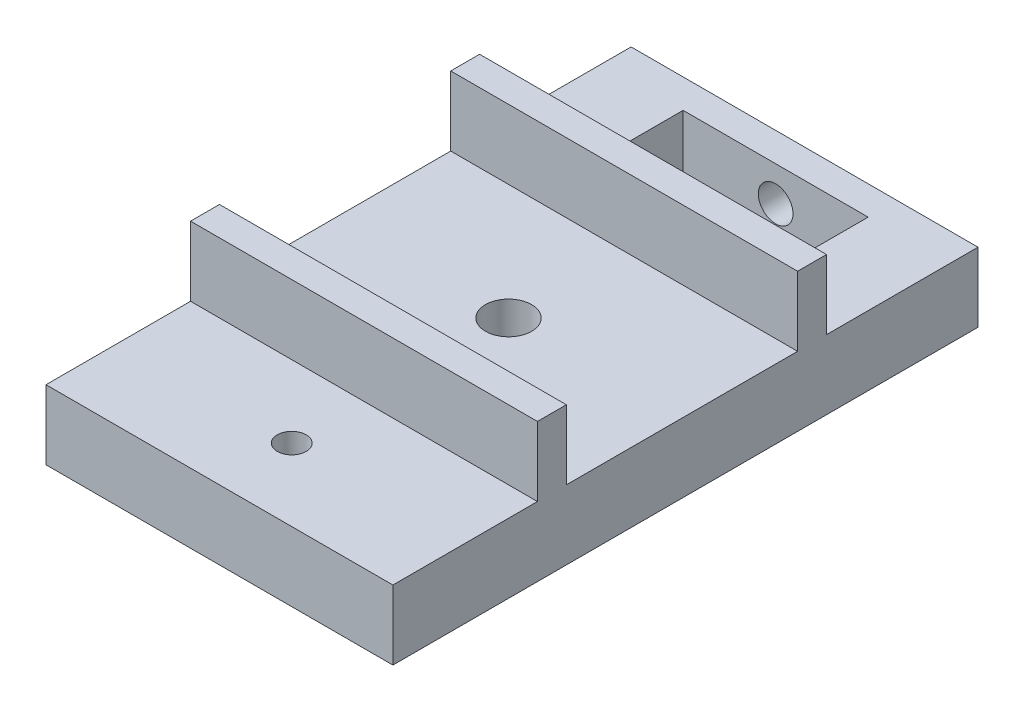
ISO-10303-21;
HEADER;
FILE_DESCRIPTION(('STEP AP214'),'2;1');
FILE_NAME('part.step','',(''),(''),'','','');
FILE_SCHEMA(('AUTOMOTIVE_DESIGN { 1 0 10303 214 1 1 1 1 }'));
ENDSEC;
DATA;
#1=APPLICATION_CONTEXT('core data for automotive mechanical design processes');
#2=APPLICATION_PROTOCOL_DEFINITION('international standard','automotive_design',2000,#1);
#3=PRODUCT_CONTEXT('',#1,'mechanical');
#4=PRODUCT('Part','Part','',(#3));
#5=PRODUCT_RELATED_PRODUCT_CATEGORY('part','',(#4));
#6=PRODUCT_DEFINITION_FORMATION('','',#4);
#7=PRODUCT_DEFINITION_CONTEXT('part definition',#1,'design');
#8=PRODUCT_DEFINITION('design','',#6,#7);
#9=PRODUCT_DEFINITION_SHAPE('','',#8);
#10=(LENGTH_UNIT() NAMED_UNIT(*) SI_UNIT(.MILLI.,.METRE.));
#11=(NAMED_UNIT(*) PLANE_ANGLE_UNIT() SI_UNIT($,.RADIAN.));
#12=(NAMED_UNIT(*) SI_UNIT($,.STERADIAN.) SOLID_ANGLE_UNIT());
#13=UNCERTAINTY_MEASURE_WITH_UNIT(LENGTH_MEASURE(1.E-05),#10,'distance_accuracy_value','');
#14=(GEOMETRIC_REPRESENTATION_CONTEXT(3) GLOBAL_UNCERTAINTY_ASSIGNED_CONTEXT((#13)) GLOBAL_UNIT_ASSIGNED_CONTEXT((#10,
#11,#12)) REPRESENTATION_CONTEXT('',''));
#15=CARTESIAN_POINT('',(0.,0.,0.));
#16=DIRECTION('',(0.,0.,1.));
#17=DIRECTION('',(1.,0.,0.));
#18=AXIS2_PLACEMENT_3D('',#15,#16,#17);
#19=CARTESIAN_POINT('',(0.,6.,0.));
#20=DIRECTION('',(0.,1.,0.));
#21=DIRECTION('',(0.,0.,1.));
#22=AXIS2_PLACEMENT_3D('',#19,#20,#21);
#23=PLANE('',#22);
#24=DIRECTION('',(-1.,0.,0.));
#25=VECTOR('',#24,1.);
#26=CARTESIAN_POINT('',(0.,6.,-2.5));
#27=LINE('',#26,#25);
#28=CARTESIAN_POINT('',(0.,6.,-2.5));
#29=VERTEX_POINT('',#28);
#30=CARTESIAN_POINT('',(-7.,6.,-2.5));
#31=VERTEX_POINT('',#30);
#32=EDGE_CURVE('E224',#29,#31,#27,.T.);
#33=ORIENTED_EDGE('',*,*,#32,.F.);
#34=DIRECTION('',(0.,0.,1.));
#35=VECTOR('',#34,1.);
#36=CARTESIAN_POINT('',(0.,6.,0.));
#37=LINE('',#36,#35);
#38=CARTESIAN_POINT('',(0.,6.,-15.6));
#39=VERTEX_POINT('',#38);
#40=EDGE_CURVE('E255',#39,#29,#37,.T.);
#41=ORIENTED_EDGE('',*,*,#40,.F.);
#42=DIRECTION('',(-1.,0.,0.));
#43=VECTOR('',#42,1.);
#44=CARTESIAN_POINT('',(0.,6.,-15.6));
#45=LINE('',#44,#43);
#46=CARTESIAN_POINT('',(-30.,6.,-15.6));
#47=VERTEX_POINT('',#46);
#48=EDGE_CURVE('E246',#39,#47,#45,.T.);
#49=ORIENTED_EDGE('',*,*,#48,.T.);
#50=DIRECTION('',(0.,0.,1.));
#51=VECTOR('',#50,1.);
#52=CARTESIAN_POINT('',(-30.,6.,0.));
#53=LINE('',#52,#51);
#54=CARTESIAN_POINT('',(-30.,6.,-2.5));
#55=VERTEX_POINT('',#54);
#56=EDGE_CURVE('E251',#47,#55,#53,.T.);
#57=ORIENTED_EDGE('',*,*,#56,.T.);
#58=CARTESIAN_POINT('',(-23.,6.,-2.5));
#59=VERTEX_POINT('',#58);
#60=EDGE_CURVE('E223',#59,#55,#27,.T.);
#61=ORIENTED_EDGE('',*,*,#60,.F.);
#62=DIRECTION('',(0.,0.,-1.));
#63=VECTOR('',#62,1.);
#64=CARTESIAN_POINT('',(-23.,6.,0.));
#65=LINE('',#64,#63);
#66=CARTESIAN_POINT('',(-23.,6.,-13.1));
#67=VERTEX_POINT('',#66);
#68=EDGE_CURVE('E258',#59,#67,#65,.T.);
#69=ORIENTED_EDGE('',*,*,#68,.T.);
#70=DIRECTION('',(1.,0.,0.));
#71=VECTOR('',#70,1.);
#72=CARTESIAN_POINT('',(0.,6.,-13.1));
#73=LINE('',#72,#71);
#74=CARTESIAN_POINT('',(-7.,6.,-13.1));
#75=VERTEX_POINT('',#74);
#76=EDGE_CURVE('E261',#67,#75,#73,.T.);
#77=ORIENTED_EDGE('',*,*,#76,.T.);
#78=DIRECTION('',(0.,0.,-1.));
#79=VECTOR('',#78,1.);
#80=CARTESIAN_POINT('',(-7.,6.,0.));
#81=LINE('',#80,#79);
#82=EDGE_CURVE('E263',#31,#75,#81,.T.);
#83=ORIENTED_EDGE('',*,*,#82,.F.);
#84=EDGE_LOOP('',(#33,#41,#49,#57,#61,#69,#77,#83));
#85=FACE_BOUND('',#84,.T.);
#86=ADVANCED_FACE('F34',(#85),#23,.T.);
#87=CARTESIAN_POINT('',(-15.,6.,10.));
#88=DIRECTION('',(0.,1.,0.));
#89=DIRECTION('',(0.,0.,1.));
#90=AXIS2_PLACEMENT_3D('',#87,#88,#89);
#91=CIRCLE('',#90,2.);
#92=CARTESIAN_POINT('',(-15.,6.,12.));
#93=VERTEX_POINT('',#92);
#94=EDGE_CURVE('E183',#93,#93,#91,.T.);
#95=ORIENTED_EDGE('',*,*,#94,.F.);
#96=EDGE_LOOP('',(#95));
#97=FACE_BOUND('',#96,.T.);
#98=DIRECTION('',(1.,0.,0.));
#99=VECTOR('',#98,1.);
#100=CARTESIAN_POINT('',(0.,6.,0.));
#101=LINE('',#100,#99);
#102=CARTESIAN_POINT('',(-30.,6.,0.));
#103=VERTEX_POINT('',#102);
#104=CARTESIAN_POINT('',(0.,6.,0.));
#105=VERTEX_POINT('',#104);
#106=EDGE_CURVE('E221',#103,#105,#101,.T.);
#107=ORIENTED_EDGE('',*,*,#106,.F.);
#108=CARTESIAN_POINT('',(-30.,6.,20.));
#109=VERTEX_POINT('',#108);
#110=EDGE_CURVE('E249',#103,#109,#53,.T.);
#111=ORIENTED_EDGE('',*,*,#110,.T.);
#112=DIRECTION('',(1.,0.,0.));
#113=VECTOR('',#112,1.);
#114=CARTESIAN_POINT('',(0.,6.,20.));
#115=LINE('',#114,#113);
#116=CARTESIAN_POINT('',(0.,6.,20.));
#117=VERTEX_POINT('',#116);
#118=EDGE_CURVE('E242',#109,#117,#115,.T.);
#119=ORIENTED_EDGE('',*,*,#118,.T.);
#120=EDGE_CURVE('E254',#105,#117,#37,.T.);
#121=ORIENTED_EDGE('',*,*,#120,.F.);
#122=EDGE_LOOP('',(#107,#111,#119,#121));
#123=FACE_BOUND('',#122,.T.);
#124=ADVANCED_FACE('F336',(#97,#123),#23,.T.);
#125=CARTESIAN_POINT('',(0.,6.,-2.5));
#126=DIRECTION('',(0.,0.,-1.));
#127=DIRECTION('',(-1.,0.,0.));
#128=AXIS2_PLACEMENT_3D('',#125,#126,#127);
#129=PLANE('',#128);
#130=CARTESIAN_POINT('',(-15.,3.,-2.5));
#131=DIRECTION('',(0.,0.,-1.));
#132=DIRECTION('',(-1.,0.,0.));
#133=AXIS2_PLACEMENT_3D('',#130,#131,#132);
#134=CIRCLE('',#133,1.5);
#135=CARTESIAN_POINT('',(-16.5,3.,-2.5));
#136=VERTEX_POINT('',#135);
#137=EDGE_CURVE('E199',#136,#136,#134,.T.);
#138=ORIENTED_EDGE('',*,*,#137,.F.);
#139=EDGE_LOOP('',(#138));
#140=FACE_BOUND('',#139,.T.);
#141=DIRECTION('',(1.,0.,0.));
#142=VECTOR('',#141,1.);
#143=CARTESIAN_POINT('',(0.,0.,-2.5));
#144=LINE('',#143,#142);
#145=CARTESIAN_POINT('',(-23.,0.,-2.5));
#146=VERTEX_POINT('',#145);
#147=CARTESIAN_POINT('',(-7.,0.,-2.5));
#148=VERTEX_POINT('',#147);
#149=EDGE_CURVE('E273',#146,#148,#144,.T.);
#150=ORIENTED_EDGE('',*,*,#149,.F.);
#151=DIRECTION('',(0.,-1.,0.));
#152=VECTOR('',#151,1.);
#153=CARTESIAN_POINT('',(-23.,6.,-2.5));
#154=LINE('',#153,#152);
#155=EDGE_CURVE('E11',#59,#146,#154,.T.);
#156=ORIENTED_EDGE('',*,*,#155,.F.);
#157=ORIENTED_EDGE('',*,*,#60,.T.);
#158=DIRECTION('',(0.,-1.,0.));
#159=VECTOR('',#158,1.);
#160=CARTESIAN_POINT('',(-30.,12.,-2.5));
#161=LINE('',#160,#159);
#162=CARTESIAN_POINT('',(-30.,12.,-2.5));
#163=VERTEX_POINT('',#162);
#164=EDGE_CURVE('E218',#163,#55,#161,.T.);
#165=ORIENTED_EDGE('',*,*,#164,.F.);
#166=DIRECTION('',(1.,0.,0.));
#167=VECTOR('',#166,1.);
#168=CARTESIAN_POINT('',(0.,12.,-2.5));
#169=LINE('',#168,#167);
#170=CARTESIAN_POINT('',(0.,12.,-2.5));
#171=VERTEX_POINT('',#170);
#172=EDGE_CURVE('E202',#163,#171,#169,.T.);
#173=ORIENTED_EDGE('',*,*,#172,.T.);
#174=DIRECTION('',(0.,-1.,0.));
#175=VECTOR('',#174,1.);
#176=CARTESIAN_POINT('',(0.,12.,-2.5));
#177=LINE('',#176,#175);
#178=EDGE_CURVE('E213',#171,#29,#177,.T.);
#179=ORIENTED_EDGE('',*,*,#178,.T.);
#180=ORIENTED_EDGE('',*,*,#32,.T.);
#181=DIRECTION('',(0.,-1.,0.));
#182=VECTOR('',#181,1.);
#183=CARTESIAN_POINT('',(-7.,6.,-2.5));
#184=LINE('',#183,#182);
#185=EDGE_CURVE('E284',#31,#148,#184,.T.);
#186=ORIENTED_EDGE('',*,*,#185,.T.);
#187=EDGE_LOOP('',(#150,#156,#157,#165,#173,#179,#180,#186));
#188=FACE_BOUND('',#187,.T.);
#189=ADVANCED_FACE('F311',(#140,#188),#129,.T.);
#190=CARTESIAN_POINT('',(-23.,6.,0.));
#191=DIRECTION('',(-1.,0.,0.));
#192=DIRECTION('',(0.,0.,1.));
#193=AXIS2_PLACEMENT_3D('',#190,#191,#192);
#194=PLANE('',#193);
#195=DIRECTION('',(0.,0.,-1.));
#196=VECTOR('',#195,1.);
#197=CARTESIAN_POINT('',(-23.,0.,0.));
#198=LINE('',#197,#196);
#199=CARTESIAN_POINT('',(-23.,0.,-13.1));
#200=VERTEX_POINT('',#199);
#201=EDGE_CURVE('E276',#146,#200,#198,.T.);
#202=ORIENTED_EDGE('',*,*,#201,.T.);
#203=DIRECTION('',(0.,-1.,0.));
#204=VECTOR('',#203,1.);
#205=CARTESIAN_POINT('',(-23.,6.,-13.1));
#206=LINE('',#205,#204);
#207=EDGE_CURVE('E43',#67,#200,#206,.T.);
#208=ORIENTED_EDGE('',*,*,#207,.F.);
#209=ORIENTED_EDGE('',*,*,#68,.F.);
#210=ORIENTED_EDGE('',*,*,#155,.T.);
#211=EDGE_LOOP('',(#202,#208,#209,#210));
#212=FACE_BOUND('',#211,.T.);
#213=ADVANCED_FACE('F322',(#212),#194,.F.);
#214=CARTESIAN_POINT('',(0.,6.,-13.1));
#215=DIRECTION('',(0.,0.,-1.));
#216=DIRECTION('',(-1.,0.,0.));
#217=AXIS2_PLACEMENT_3D('',#214,#215,#216);
#218=PLANE('',#217);
#219=CARTESIAN_POINT('',(-15.,3.,-13.1));
#220=DIRECTION('',(0.,0.,-1.));
#221=DIRECTION('',(-1.,0.,0.));
#222=AXIS2_PLACEMENT_3D('',#219,#220,#221);
#223=CIRCLE('',#222,1.5);
#224=CARTESIAN_POINT('',(-16.5,3.,-13.1));
#225=VERTEX_POINT('',#224);
#226=EDGE_CURVE('E194',#225,#225,#223,.T.);
#227=ORIENTED_EDGE('',*,*,#226,.T.);
#228=EDGE_LOOP('',(#227));
#229=FACE_BOUND('',#228,.T.);
#230=DIRECTION('',(1.,0.,0.));
#231=VECTOR('',#230,1.);
#232=CARTESIAN_POINT('',(0.,0.,-13.1));
#233=LINE('',#232,#231);
#234=CARTESIAN_POINT('',(-7.,0.,-13.1));
#235=VERTEX_POINT('',#234);
#236=EDGE_CURVE('E279',#200,#235,#233,.T.);
#237=ORIENTED_EDGE('',*,*,#236,.T.);
#238=DIRECTION('',(0.,-1.,0.));
#239=VECTOR('',#238,1.);
#240=CARTESIAN_POINT('',(-7.,6.,-13.1));
#241=LINE('',#240,#239);
#242=EDGE_CURVE('E286',#75,#235,#241,.T.);
#243=ORIENTED_EDGE('',*,*,#242,.F.);
#244=ORIENTED_EDGE('',*,*,#76,.F.);
#245=ORIENTED_EDGE('',*,*,#207,.T.);
#246=EDGE_LOOP('',(#237,#243,#244,#245));
#247=FACE_BOUND('',#246,.T.);
#248=ADVANCED_FACE('F324',(#229,#247),#218,.F.);
#249=CARTESIAN_POINT('',(0.,6.,-15.6));
#250=DIRECTION('',(0.,0.,1.));
#251=DIRECTION('',(1.,0.,0.));
#252=AXIS2_PLACEMENT_3D('',#249,#250,#251);
#253=PLANE('',#252);
#254=CARTESIAN_POINT('',(-15.,3.,-15.6));
#255=DIRECTION('',(0.,0.,-1.));
#256=DIRECTION('',(-1.,0.,0.));
#257=AXIS2_PLACEMENT_3D('',#254,#255,#256);
#258=CIRCLE('',#257,1.5);
#259=CARTESIAN_POINT('',(-16.5,3.,-15.6));
#260=VERTEX_POINT('',#259);
#261=EDGE_CURVE('E188',#260,#260,#258,.T.);
#262=ORIENTED_EDGE('',*,*,#261,.F.);
#263=EDGE_LOOP('',(#262));
#264=FACE_BOUND('',#263,.T.);
#265=DIRECTION('',(-1.,0.,0.));
#266=VECTOR('',#265,1.);
#267=CARTESIAN_POINT('',(0.,0.,-15.6));
#268=LINE('',#267,#266);
#269=CARTESIAN_POINT('',(0.,0.,-15.6));
#270=VERTEX_POINT('',#269);
#271=CARTESIAN_POINT('',(-30.,0.,-15.6));
#272=VERTEX_POINT('',#271);
#273=EDGE_CURVE('E245',#270,#272,#268,.T.);
#274=ORIENTED_EDGE('',*,*,#273,.T.);
#275=DIRECTION('',(0.,-1.,0.));
#276=VECTOR('',#275,1.);
#277=CARTESIAN_POINT('',(-30.,6.,-15.6));
#278=LINE('',#277,#276);
#279=EDGE_CURVE('E38',#47,#272,#278,.T.);
#280=ORIENTED_EDGE('',*,*,#279,.F.);
#281=ORIENTED_EDGE('',*,*,#48,.F.);
#282=DIRECTION('',(0.,-1.,0.));
#283=VECTOR('',#282,1.);
#284=CARTESIAN_POINT('',(0.,6.,-15.6));
#285=LINE('',#284,#283);
#286=EDGE_CURVE('E266',#39,#270,#285,.T.);
#287=ORIENTED_EDGE('',*,*,#286,.T.);
#288=EDGE_LOOP('',(#274,#280,#281,#287));
#289=FACE_BOUND('',#288,.T.);
#290=ADVANCED_FACE('F36',(#264,#289),#253,.F.);
#291=CARTESIAN_POINT('',(-30.,6.,0.));
#292=DIRECTION('',(1.,0.,0.));
#293=DIRECTION('',(0.,0.,-1.));
#294=AXIS2_PLACEMENT_3D('',#291,#292,#293);
#295=PLANE('',#294);
#296=ORIENTED_EDGE('',*,*,#110,.F.);
#297=DIRECTION('',(0.,-1.,0.));
#298=VECTOR('',#297,1.);
#299=CARTESIAN_POINT('',(-30.,12.,0.));
#300=LINE('',#299,#298);
#301=CARTESIAN_POINT('',(-30.,12.,0.));
#302=VERTEX_POINT('',#301);
#303=EDGE_CURVE('E216',#302,#103,#300,.T.);
#304=ORIENTED_EDGE('',*,*,#303,.F.);
#305=DIRECTION('',(0.,0.,-1.));
#306=VECTOR('',#305,1.);
#307=CARTESIAN_POINT('',(-30.,12.,0.));
#308=LINE('',#307,#306);
#309=EDGE_CURVE('E205',#302,#163,#308,.T.);
#310=ORIENTED_EDGE('',*,*,#309,.T.);
#311=ORIENTED_EDGE('',*,*,#164,.T.);
#312=ORIENTED_EDGE('',*,*,#56,.F.);
#313=ORIENTED_EDGE('',*,*,#279,.T.);
#314=DIRECTION('',(0.,0.,1.));
#315=VECTOR('',#314,1.);
#316=CARTESIAN_POINT('',(-30.,0.,0.));
#317=LINE('',#316,#315);
#318=CARTESIAN_POINT('',(-30.,0.,35.));
#319=VERTEX_POINT('',#318);
#320=EDGE_CURVE('E269',#272,#319,#317,.T.);
#321=ORIENTED_EDGE('',*,*,#320,.T.);
#322=DIRECTION('',(0.,-1.,0.));
#323=VECTOR('',#322,1.);
#324=CARTESIAN_POINT('',(-30.,6.,35.));
#325=LINE('',#324,#323);
#326=CARTESIAN_POINT('',(-30.,6.,35.));
#327=VERTEX_POINT('',#326);
#328=EDGE_CURVE('E167',#327,#319,#325,.T.);
#329=ORIENTED_EDGE('',*,*,#328,.F.);
#330=DIRECTION('',(0.,0.,1.));
#331=VECTOR('',#330,1.);
#332=CARTESIAN_POINT('',(-30.,6.,0.));
#333=LINE('',#332,#331);
#334=CARTESIAN_POINT('',(-30.,6.,22.5));
#335=VERTEX_POINT('',#334);
#336=EDGE_CURVE('E155',#335,#327,#333,.T.);
#337=ORIENTED_EDGE('',*,*,#336,.F.);
#338=DIRECTION('',(0.,-1.,0.));
#339=VECTOR('',#338,1.);
#340=CARTESIAN_POINT('',(-30.,6.,22.5));
#341=LINE('',#340,#339);
#342=CARTESIAN_POINT('',(-30.,12.,22.5));
#343=VERTEX_POINT('',#342);
#344=EDGE_CURVE('E291',#343,#335,#341,.T.);
#345=ORIENTED_EDGE('',*,*,#344,.F.);
#346=DIRECTION('',(0.,0.,-1.));
#347=VECTOR('',#346,1.);
#348=CARTESIAN_POINT('',(-30.,12.,0.));
#349=LINE('',#348,#347);
#350=CARTESIAN_POINT('',(-30.,12.,20.));
#351=VERTEX_POINT('',#350);
#352=EDGE_CURVE('E226',#343,#351,#349,.T.);
#353=ORIENTED_EDGE('',*,*,#352,.T.);
#354=DIRECTION('',(0.,-1.,0.));
#355=VECTOR('',#354,1.);
#356=CARTESIAN_POINT('',(-30.,12.,20.));
#357=LINE('',#356,#355);
#358=EDGE_CURVE('E236',#351,#109,#357,.T.);
#359=ORIENTED_EDGE('',*,*,#358,.T.);
#360=EDGE_LOOP('',(#296,#304,#310,#311,#312,#313,#321,#329,#337,#345,#353,#359));
#361=FACE_BOUND('',#360,.T.);
#362=ADVANCED_FACE('F296',(#361),#295,.F.);
#363=CARTESIAN_POINT('',(0.,6.,22.5));
#364=DIRECTION('',(0.,0.,1.));
#365=DIRECTION('',(1.,0.,0.));
#366=AXIS2_PLACEMENT_3D('',#363,#364,#365);
#367=PLANE('',#366);
#368=DIRECTION('',(-1.,0.,0.));
#369=VECTOR('',#368,1.);
#370=CARTESIAN_POINT('',(0.,6.,22.5));
#371=LINE('',#370,#369);
#372=CARTESIAN_POINT('',(0.,6.,22.5));
#373=VERTEX_POINT('',#372);
#374=EDGE_CURVE('E51',#373,#335,#371,.T.);
#375=ORIENTED_EDGE('',*,*,#374,.F.);
#376=DIRECTION('',(0.,-1.,0.));
#377=VECTOR('',#376,1.);
#378=CARTESIAN_POINT('',(0.,6.,22.5));
#379=LINE('',#378,#377);
#380=CARTESIAN_POINT('',(0.,12.,22.5));
#381=VERTEX_POINT('',#380);
#382=EDGE_CURVE('E172',#381,#373,#379,.T.);
#383=ORIENTED_EDGE('',*,*,#382,.F.);
#384=DIRECTION('',(-1.,0.,0.));
#385=VECTOR('',#384,1.);
#386=CARTESIAN_POINT('',(0.,12.,22.5));
#387=LINE('',#386,#385);
#388=EDGE_CURVE('E229',#381,#343,#387,.T.);
#389=ORIENTED_EDGE('',*,*,#388,.T.);
#390=ORIENTED_EDGE('',*,*,#344,.T.);
#391=EDGE_LOOP('',(#375,#383,#389,#390));
#392=FACE_BOUND('',#391,.T.);
#393=ADVANCED_FACE('F352',(#392),#367,.T.);
#394=CARTESIAN_POINT('',(0.,6.,0.));
#395=DIRECTION('',(1.,0.,0.));
#396=DIRECTION('',(0.,0.,-1.));
#397=AXIS2_PLACEMENT_3D('',#394,#395,#396);
#398=PLANE('',#397);
#399=ORIENTED_EDGE('',*,*,#382,.T.);
#400=DIRECTION('',(0.,0.,-1.));
#401=VECTOR('',#400,1.);
#402=CARTESIAN_POINT('',(0.,6.,0.));
#403=LINE('',#402,#401);
#404=CARTESIAN_POINT('',(0.,6.,35.));
#405=VERTEX_POINT('',#404);
#406=EDGE_CURVE('E153',#405,#373,#403,.T.);
#407=ORIENTED_EDGE('',*,*,#406,.F.);
#408=DIRECTION('',(0.,-1.,0.));
#409=VECTOR('',#408,1.);
#410=CARTESIAN_POINT('',(0.,6.,35.));
#411=LINE('',#410,#409);
#412=CARTESIAN_POINT('',(0.,0.,35.));
#413=VERTEX_POINT('',#412);
#414=EDGE_CURVE('E162',#405,#413,#411,.T.);
#415=ORIENTED_EDGE('',*,*,#414,.T.);
#416=DIRECTION('',(0.,0.,1.));
#417=VECTOR('',#416,1.);
#418=CARTESIAN_POINT('',(0.,0.,0.));
#419=LINE('',#418,#417);
#420=EDGE_CURVE('E271',#270,#413,#419,.T.);
#421=ORIENTED_EDGE('',*,*,#420,.F.);
#422=ORIENTED_EDGE('',*,*,#286,.F.);
#423=ORIENTED_EDGE('',*,*,#40,.T.);
#424=ORIENTED_EDGE('',*,*,#178,.F.);
#425=DIRECTION('',(0.,0.,-1.));
#426=VECTOR('',#425,1.);
#427=CARTESIAN_POINT('',(0.,12.,0.));
#428=LINE('',#427,#426);
#429=CARTESIAN_POINT('',(0.,12.,0.));
#430=VERTEX_POINT('',#429);
#431=EDGE_CURVE('E211',#430,#171,#428,.T.);
#432=ORIENTED_EDGE('',*,*,#431,.F.);
#433=DIRECTION('',(0.,-1.,0.));
#434=VECTOR('',#433,1.);
#435=CARTESIAN_POINT('',(0.,12.,0.));
#436=LINE('',#435,#434);
#437=EDGE_CURVE('E59',#430,#105,#436,.T.);
#438=ORIENTED_EDGE('',*,*,#437,.T.);
#439=ORIENTED_EDGE('',*,*,#120,.T.);
#440=DIRECTION('',(0.,-1.,0.));
#441=VECTOR('',#440,1.);
#442=CARTESIAN_POINT('',(0.,12.,20.));
#443=LINE('',#442,#441);
#444=CARTESIAN_POINT('',(0.,12.,20.));
#445=VERTEX_POINT('',#444);
#446=EDGE_CURVE('E239',#445,#117,#443,.T.);
#447=ORIENTED_EDGE('',*,*,#446,.F.);
#448=DIRECTION('',(0.,0.,1.));
#449=VECTOR('',#448,1.);
#450=CARTESIAN_POINT('',(0.,12.,0.));
#451=LINE('',#450,#449);
#452=EDGE_CURVE('E232',#445,#381,#451,.T.);
#453=ORIENTED_EDGE('',*,*,#452,.T.);
#454=EDGE_LOOP('',(#399,#407,#415,#421,#422,#423,#424,#432,#438,#439,#447,#453));
#455=FACE_BOUND('',#454,.T.);
#456=ADVANCED_FACE('F170',(#455),#398,.T.);
#457=CARTESIAN_POINT('',(-7.,6.,0.));
#458=DIRECTION('',(-1.,0.,0.));
#459=DIRECTION('',(0.,0.,1.));
#460=AXIS2_PLACEMENT_3D('',#457,#458,#459);
#461=PLANE('',#460);
#462=DIRECTION('',(0.,0.,-1.));
#463=VECTOR('',#462,1.);
#464=CARTESIAN_POINT('',(-7.,0.,0.));
#465=LINE('',#464,#463);
#466=EDGE_CURVE('E250',#148,#235,#465,.T.);
#467=ORIENTED_EDGE('',*,*,#466,.F.);
#468=ORIENTED_EDGE('',*,*,#185,.F.);
#469=ORIENTED_EDGE('',*,*,#82,.T.);
#470=ORIENTED_EDGE('',*,*,#242,.T.);
#471=EDGE_LOOP('',(#467,#468,#469,#470));
#472=FACE_BOUND('',#471,.T.);
#473=ADVANCED_FACE('F314',(#472),#461,.T.);
#474=CARTESIAN_POINT('',(0.,0.,0.));
#475=DIRECTION('',(0.,1.,0.));
#476=DIRECTION('',(0.,0.,1.));
#477=AXIS2_PLACEMENT_3D('',#474,#475,#476);
#478=PLANE('',#477);
#479=CARTESIAN_POINT('',(-15.,0.,10.));
#480=DIRECTION('',(0.,1.,0.));
#481=DIRECTION('',(0.,0.,1.));
#482=AXIS2_PLACEMENT_3D('',#479,#480,#481);
#483=CIRCLE('',#482,2.);
#484=CARTESIAN_POINT('',(-15.,0.,12.));
#485=VERTEX_POINT('',#484);
#486=EDGE_CURVE('E185',#485,#485,#483,.T.);
#487=ORIENTED_EDGE('',*,*,#486,.T.);
#488=EDGE_LOOP('',(#487));
#489=FACE_BOUND('',#488,.T.);
#490=ORIENTED_EDGE('',*,*,#149,.T.);
#491=ORIENTED_EDGE('',*,*,#466,.T.);
#492=ORIENTED_EDGE('',*,*,#236,.F.);
#493=ORIENTED_EDGE('',*,*,#201,.F.);
#494=EDGE_LOOP('',(#490,#491,#492,#493));
#495=FACE_BOUND('',#494,.T.);
#496=ORIENTED_EDGE('',*,*,#420,.T.);
#497=DIRECTION('',(1.,0.,0.));
#498=VECTOR('',#497,1.);
#499=CARTESIAN_POINT('',(0.,0.,35.));
#500=LINE('',#499,#498);
#501=EDGE_CURVE('E165',#319,#413,#500,.T.);
#502=ORIENTED_EDGE('',*,*,#501,.F.);
#503=ORIENTED_EDGE('',*,*,#320,.F.);
#504=ORIENTED_EDGE('',*,*,#273,.F.);
#505=EDGE_LOOP('',(#496,#502,#503,#504));
#506=FACE_BOUND('',#505,.T.);
#507=CARTESIAN_POINT('',(-15.,0.,28.75));
#508=DIRECTION('',(0.,-1.,0.));
#509=DIRECTION('',(0.,0.,-1.));
#510=AXIS2_PLACEMENT_3D('',#507,#508,#509);
#511=CIRCLE('',#510,1.25);
#512=CARTESIAN_POINT('',(-15.,0.,27.5));
#513=VERTEX_POINT('',#512);
#514=EDGE_CURVE('E174',#513,#513,#511,.T.);
#515=ORIENTED_EDGE('',*,*,#514,.F.);
#516=EDGE_LOOP('',(#515));
#517=FACE_BOUND('',#516,.T.);
#518=ADVANCED_FACE('F301',(#489,#495,#506,#517),#478,.F.);
#519=CARTESIAN_POINT('',(0.,12.,20.));
#520=DIRECTION('',(0.,0.,1.));
#521=DIRECTION('',(1.,0.,0.));
#522=AXIS2_PLACEMENT_3D('',#519,#520,#521);
#523=PLANE('',#522);
#524=ORIENTED_EDGE('',*,*,#118,.F.);
#525=ORIENTED_EDGE('',*,*,#358,.F.);
#526=DIRECTION('',(-1.,0.,0.));
#527=VECTOR('',#526,1.);
#528=CARTESIAN_POINT('',(0.,12.,20.));
#529=LINE('',#528,#527);
#530=EDGE_CURVE('E234',#445,#351,#529,.T.);
#531=ORIENTED_EDGE('',*,*,#530,.F.);
#532=ORIENTED_EDGE('',*,*,#446,.T.);
#533=EDGE_LOOP('',(#524,#525,#531,#532));
#534=FACE_BOUND('',#533,.T.);
#535=ADVANCED_FACE('F344',(#534),#523,.F.);
#536=CARTESIAN_POINT('',(0.,12.,0.));
#537=DIRECTION('',(0.,1.,0.));
#538=DIRECTION('',(0.,0.,1.));
#539=AXIS2_PLACEMENT_3D('',#536,#537,#538);
#540=PLANE('',#539);
#541=ORIENTED_EDGE('',*,*,#352,.F.);
#542=ORIENTED_EDGE('',*,*,#388,.F.);
#543=ORIENTED_EDGE('',*,*,#452,.F.);
#544=ORIENTED_EDGE('',*,*,#530,.T.);
#545=EDGE_LOOP('',(#541,#542,#543,#544));
#546=FACE_BOUND('',#545,.T.);
#547=ADVANCED_FACE('F451',(#546),#540,.T.);
#548=CARTESIAN_POINT('',(0.,12.,0.));
#549=DIRECTION('',(0.,0.,1.));
#550=DIRECTION('',(1.,0.,0.));
#551=AXIS2_PLACEMENT_3D('',#548,#549,#550);
#552=PLANE('',#551);
#553=ORIENTED_EDGE('',*,*,#303,.T.);
#554=ORIENTED_EDGE('',*,*,#106,.T.);
#555=ORIENTED_EDGE('',*,*,#437,.F.);
#556=DIRECTION('',(-1.,0.,0.));
#557=VECTOR('',#556,1.);
#558=CARTESIAN_POINT('',(0.,12.,0.));
#559=LINE('',#558,#557);
#560=EDGE_CURVE('E208',#430,#302,#559,.T.);
#561=ORIENTED_EDGE('',*,*,#560,.T.);
#562=EDGE_LOOP('',(#553,#554,#555,#561));
#563=FACE_BOUND('',#562,.T.);
#564=ADVANCED_FACE('F448',(#563),#552,.T.);
#565=CARTESIAN_POINT('',(0.,12.,0.));
#566=DIRECTION('',(0.,1.,0.));
#567=DIRECTION('',(0.,0.,1.));
#568=AXIS2_PLACEMENT_3D('',#565,#566,#567);
#569=PLANE('',#568);
#570=ORIENTED_EDGE('',*,*,#172,.F.);
#571=ORIENTED_EDGE('',*,*,#309,.F.);
#572=ORIENTED_EDGE('',*,*,#560,.F.);
#573=ORIENTED_EDGE('',*,*,#431,.T.);
#574=EDGE_LOOP('',(#570,#571,#572,#573));
#575=FACE_BOUND('',#574,.T.);
#576=ADVANCED_FACE('F445',(#575),#569,.T.);
#577=CARTESIAN_POINT('',(-15.,3.,-0.600000000000003));
#578=DIRECTION('',(0.,0.,-1.));
#579=DIRECTION('',(-1.,0.,0.));
#580=AXIS2_PLACEMENT_3D('',#577,#578,#579);
#581=CYLINDRICAL_SURFACE('',#580,1.5);
#582=ORIENTED_EDGE('',*,*,#261,.T.);
#583=EDGE_LOOP('',(#582));
#584=FACE_BOUND('',#583,.T.);
#585=ORIENTED_EDGE('',*,*,#226,.F.);
#586=EDGE_LOOP('',(#585));
#587=FACE_BOUND('',#586,.T.);
#588=ADVANCED_FACE('F443',(#584,#587),#581,.F.);
#589=ORIENTED_EDGE('',*,*,#137,.T.);
#590=EDGE_LOOP('',(#589));
#591=FACE_BOUND('',#590,.T.);
#592=CARTESIAN_POINT('',(-15.,3.,-0.600000000000003));
#593=DIRECTION('',(0.,0.,-1.));
#594=DIRECTION('',(-1.,0.,0.));
#595=AXIS2_PLACEMENT_3D('',#592,#593,#594);
#596=CIRCLE('',#595,1.5);
#597=CARTESIAN_POINT('',(-16.5,3.,-0.600000000000003));
#598=VERTEX_POINT('',#597);
#599=EDGE_CURVE('E191',#598,#598,#596,.T.);
#600=ORIENTED_EDGE('',*,*,#599,.F.);
#601=EDGE_LOOP('',(#600));
#602=FACE_BOUND('',#601,.T.);
#603=ADVANCED_FACE('F439',(#591,#602),#581,.F.);
#604=CARTESIAN_POINT('',(-15.,3.,-0.600000000000003));
#605=DIRECTION('',(0.,0.,-1.));
#606=DIRECTION('',(-1.,0.,0.));
#607=AXIS2_PLACEMENT_3D('',#604,#605,#606);
#608=PLANE('',#607);
#609=ORIENTED_EDGE('',*,*,#599,.T.);
#610=EDGE_LOOP('',(#609));
#611=FACE_BOUND('',#610,.T.);
#612=ADVANCED_FACE('F435',(#611),#608,.T.);
#613=CARTESIAN_POINT('',(-15.,0.,10.));
#614=DIRECTION('',(0.,1.,0.));
#615=DIRECTION('',(0.,0.,1.));
#616=AXIS2_PLACEMENT_3D('',#613,#614,#615);
#617=CYLINDRICAL_SURFACE('',#616,2.);
#618=ORIENTED_EDGE('',*,*,#486,.F.);
#619=EDGE_LOOP('',(#618));
#620=FACE_BOUND('',#619,.T.);
#621=ORIENTED_EDGE('',*,*,#94,.T.);
#622=EDGE_LOOP('',(#621));
#623=FACE_BOUND('',#622,.T.);
#624=ADVANCED_FACE('F396',(#620,#623),#617,.F.);
#625=CARTESIAN_POINT('',(0.,6.,35.));
#626=DIRECTION('',(0.,0.,-1.));
#627=DIRECTION('',(-1.,0.,0.));
#628=AXIS2_PLACEMENT_3D('',#625,#626,#627);
#629=PLANE('',#628);
#630=ORIENTED_EDGE('',*,*,#501,.T.);
#631=ORIENTED_EDGE('',*,*,#414,.F.);
#632=DIRECTION('',(1.,0.,0.));
#633=VECTOR('',#632,1.);
#634=CARTESIAN_POINT('',(0.,6.,35.));
#635=LINE('',#634,#633);
#636=EDGE_CURVE('E148',#327,#405,#635,.T.);
#637=ORIENTED_EDGE('',*,*,#636,.F.);
#638=ORIENTED_EDGE('',*,*,#328,.T.);
#639=EDGE_LOOP('',(#630,#631,#637,#638));
#640=FACE_BOUND('',#639,.T.);
#641=ADVANCED_FACE('F163',(#640),#629,.F.);
#642=CARTESIAN_POINT('',(-15.,6.,28.75));
#643=DIRECTION('',(0.,-1.,0.));
#644=DIRECTION('',(0.,0.,-1.));
#645=AXIS2_PLACEMENT_3D('',#642,#643,#644);
#646=CYLINDRICAL_SURFACE('',#645,1.25);
#647=CARTESIAN_POINT('',(-15.,6.,28.75));
#648=DIRECTION('',(0.,-1.,0.));
#649=DIRECTION('',(0.,0.,-1.));
#650=AXIS2_PLACEMENT_3D('',#647,#648,#649);
#651=CIRCLE('',#650,1.25);
#652=CARTESIAN_POINT('',(-15.,6.,27.5));
#653=VERTEX_POINT('',#652);
#654=EDGE_CURVE('E168',#653,#653,#651,.T.);
#655=ORIENTED_EDGE('',*,*,#654,.F.);
#656=EDGE_LOOP('',(#655));
#657=FACE_BOUND('',#656,.T.);
#658=ORIENTED_EDGE('',*,*,#514,.T.);
#659=EDGE_LOOP('',(#658));
#660=FACE_BOUND('',#659,.T.);
#661=ADVANCED_FACE('F395',(#657,#660),#646,.F.);
#662=CARTESIAN_POINT('',(0.,6.,0.));
#663=DIRECTION('',(0.,-1.,0.));
#664=DIRECTION('',(0.,0.,-1.));
#665=AXIS2_PLACEMENT_3D('',#662,#663,#664);
#666=PLANE('',#665);
#667=ORIENTED_EDGE('',*,*,#374,.T.);
#668=ORIENTED_EDGE('',*,*,#336,.T.);
#669=ORIENTED_EDGE('',*,*,#636,.T.);
#670=ORIENTED_EDGE('',*,*,#406,.T.);
#671=EDGE_LOOP('',(#667,#668,#669,#670));
#672=FACE_BOUND('',#671,.T.);
#673=ORIENTED_EDGE('',*,*,#654,.T.);
#674=EDGE_LOOP('',(#673));
#675=FACE_BOUND('',#674,.T.);
#676=ADVANCED_FACE('F150',(#672,#675),#666,.F.);
#677=CLOSED_SHELL('',(#86,#124,#189,#213,#248,#290,#362,#393,#456,#473,#518,#535,#547,#564,#576,
#588,#603,#612,#624,#641,#661,#676));
#678=MANIFOLD_SOLID_BREP('B2',#677);
#679=ADVANCED_BREP_SHAPE_REPRESENTATION('',(#18,#678),#14);
#680=SHAPE_DEFINITION_REPRESENTATION(#9,#679);
ENDSEC;
END-ISO-10303-21;
